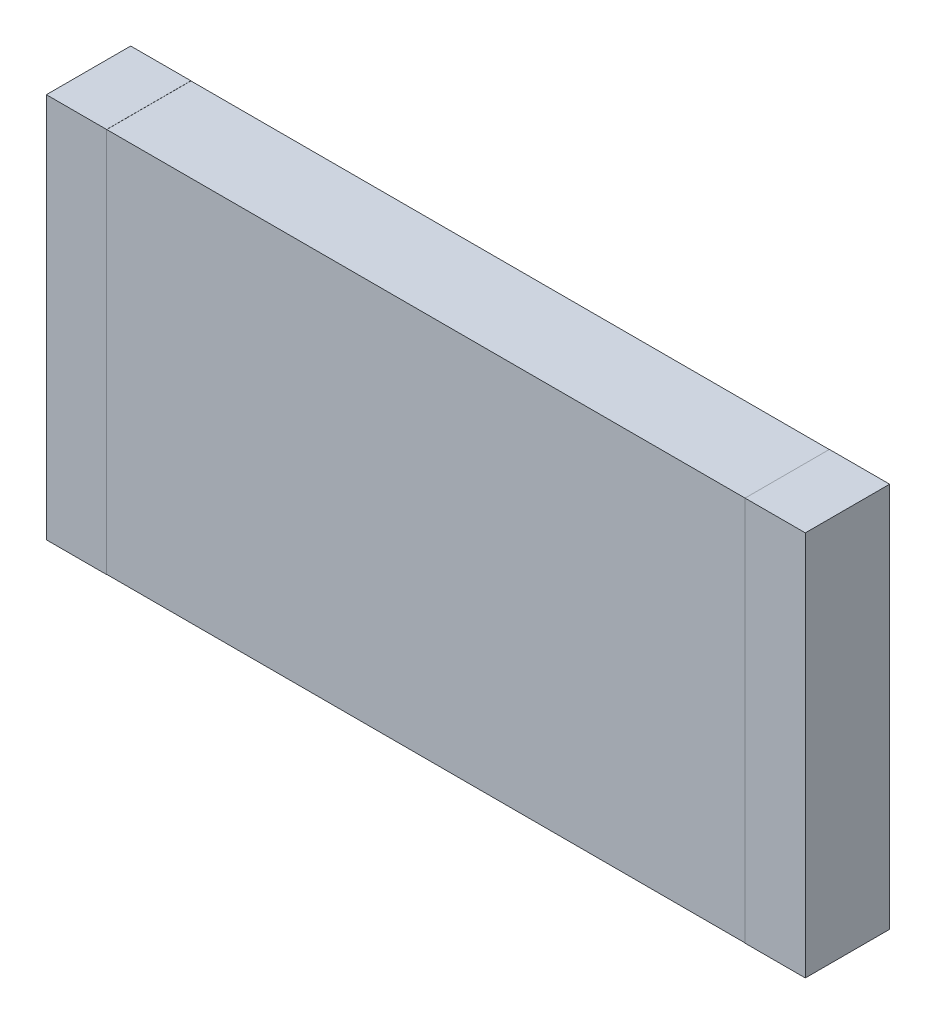
ISO-10303-21;
HEADER;
FILE_DESCRIPTION(('STEP AP214'),'2;1');
FILE_NAME('part.step','',(''),(''),'','','');
FILE_SCHEMA(('AUTOMOTIVE_DESIGN { 1 0 10303 214 1 1 1 1 }'));
ENDSEC;
DATA;
#1=APPLICATION_CONTEXT('core data for automotive mechanical design processes');
#2=APPLICATION_PROTOCOL_DEFINITION('international standard','automotive_design',2000,#1);
#3=PRODUCT_CONTEXT('',#1,'mechanical');
#4=PRODUCT('Part','Part','',(#3));
#5=PRODUCT_RELATED_PRODUCT_CATEGORY('part','',(#4));
#6=PRODUCT_DEFINITION_FORMATION('','',#4);
#7=PRODUCT_DEFINITION_CONTEXT('part definition',#1,'design');
#8=PRODUCT_DEFINITION('design','',#6,#7);
#9=PRODUCT_DEFINITION_SHAPE('','',#8);
#10=(LENGTH_UNIT() NAMED_UNIT(*) SI_UNIT(.MILLI.,.METRE.));
#11=(NAMED_UNIT(*) PLANE_ANGLE_UNIT() SI_UNIT($,.RADIAN.));
#12=(NAMED_UNIT(*) SI_UNIT($,.STERADIAN.) SOLID_ANGLE_UNIT());
#13=UNCERTAINTY_MEASURE_WITH_UNIT(LENGTH_MEASURE(1.E-05),#10,'distance_accuracy_value','');
#14=(GEOMETRIC_REPRESENTATION_CONTEXT(3) GLOBAL_UNCERTAINTY_ASSIGNED_CONTEXT((#13)) GLOBAL_UNIT_ASSIGNED_CONTEXT((#10,
#11,#12)) REPRESENTATION_CONTEXT('',''));
#15=CARTESIAN_POINT('',(0.,0.,0.));
#16=DIRECTION('',(0.,0.,1.));
#17=DIRECTION('',(1.,0.,0.));
#18=AXIS2_PLACEMENT_3D('',#15,#16,#17);
#19=CARTESIAN_POINT('',(-2.65,1.6,0.7));
#20=DIRECTION('',(-1.,0.,0.));
#21=DIRECTION('',(0.,0.,1.));
#22=AXIS2_PLACEMENT_3D('',#19,#20,#21);
#23=PLANE('',#22);
#24=DIRECTION('',(0.,0.,1.));
#25=VECTOR('',#24,1.);
#26=CARTESIAN_POINT('',(-2.65,1.6,0.7));
#27=LINE('',#26,#25);
#28=CARTESIAN_POINT('',(-2.65,1.6,0.7));
#29=VERTEX_POINT('',#28);
#30=CARTESIAN_POINT('',(-2.65,1.6,0.));
#31=VERTEX_POINT('',#30);
#32=EDGE_CURVE('E109',#29,#31,#27,.F.);
#33=ORIENTED_EDGE('',*,*,#32,.F.);
#34=DIRECTION('',(0.,1.,0.));
#35=VECTOR('',#34,1.);
#36=CARTESIAN_POINT('',(-2.65,0.,0.7));
#37=LINE('',#36,#35);
#38=CARTESIAN_POINT('',(-2.65,-1.6,0.7));
#39=VERTEX_POINT('',#38);
#40=EDGE_CURVE('E108',#39,#29,#37,.T.);
#41=ORIENTED_EDGE('',*,*,#40,.F.);
#42=DIRECTION('',(0.,0.,1.));
#43=VECTOR('',#42,1.);
#44=CARTESIAN_POINT('',(-2.65,-1.6,0.7));
#45=LINE('',#44,#43);
#46=CARTESIAN_POINT('',(-2.65,-1.6,0.));
#47=VERTEX_POINT('',#46);
#48=EDGE_CURVE('E106',#47,#39,#45,.T.);
#49=ORIENTED_EDGE('',*,*,#48,.F.);
#50=DIRECTION('',(0.,1.,0.));
#51=VECTOR('',#50,1.);
#52=CARTESIAN_POINT('',(-2.65,0.,0.));
#53=LINE('',#52,#51);
#54=CARTESIAN_POINT('',(-2.65,-1.599,0.));
#55=VERTEX_POINT('',#54);
#56=EDGE_CURVE('E20',#55,#47,#53,.F.);
#57=ORIENTED_EDGE('',*,*,#56,.F.);
#58=DIRECTION('',(0.,0.,1.));
#59=VECTOR('',#58,1.);
#60=CARTESIAN_POINT('',(-2.65,-1.599,0.7));
#61=LINE('',#60,#59);
#62=CARTESIAN_POINT('',(-2.65,-1.599,0.699));
#63=VERTEX_POINT('',#62);
#64=EDGE_CURVE('E120',#63,#55,#61,.F.);
#65=ORIENTED_EDGE('',*,*,#64,.F.);
#66=DIRECTION('',(0.,1.,0.));
#67=VECTOR('',#66,1.);
#68=CARTESIAN_POINT('',(-2.65,-1.6,0.699000000000001));
#69=LINE('',#68,#67);
#70=CARTESIAN_POINT('',(-2.65,1.599,0.699));
#71=VERTEX_POINT('',#70);
#72=EDGE_CURVE('E137',#63,#71,#69,.T.);
#73=ORIENTED_EDGE('',*,*,#72,.T.);
#74=DIRECTION('',(0.,0.,1.));
#75=VECTOR('',#74,1.);
#76=CARTESIAN_POINT('',(-2.65,1.599,0.7));
#77=LINE('',#76,#75);
#78=CARTESIAN_POINT('',(-2.65,1.599,0.));
#79=VERTEX_POINT('',#78);
#80=EDGE_CURVE('E121',#79,#71,#77,.T.);
#81=ORIENTED_EDGE('',*,*,#80,.F.);
#82=DIRECTION('',(0.,1.,0.));
#83=VECTOR('',#82,1.);
#84=CARTESIAN_POINT('',(-2.65,0.,0.));
#85=LINE('',#84,#83);
#86=EDGE_CURVE('E165',#31,#79,#85,.F.);
#87=ORIENTED_EDGE('',*,*,#86,.F.);
#88=EDGE_LOOP('',(#33,#41,#49,#57,#65,#73,#81,#87));
#89=FACE_BOUND('',#88,.T.);
#90=ADVANCED_FACE('F17',(#89),#23,.F.);
#91=CARTESIAN_POINT('',(2.65,1.6,0.7));
#92=DIRECTION('',(1.,0.,0.));
#93=DIRECTION('',(0.,0.,-1.));
#94=AXIS2_PLACEMENT_3D('',#91,#92,#93);
#95=PLANE('',#94);
#96=DIRECTION('',(0.,0.,-1.));
#97=VECTOR('',#96,1.);
#98=CARTESIAN_POINT('',(2.65,1.599,0.7));
#99=LINE('',#98,#97);
#100=CARTESIAN_POINT('',(2.65,1.599,0.699));
#101=VERTEX_POINT('',#100);
#102=CARTESIAN_POINT('',(2.65,1.599,0.));
#103=VERTEX_POINT('',#102);
#104=EDGE_CURVE('E161',#101,#103,#99,.T.);
#105=ORIENTED_EDGE('',*,*,#104,.F.);
#106=DIRECTION('',(0.,1.,0.));
#107=VECTOR('',#106,1.);
#108=CARTESIAN_POINT('',(2.65,-1.6,0.699));
#109=LINE('',#108,#107);
#110=CARTESIAN_POINT('',(2.65,-1.599,0.699));
#111=VERTEX_POINT('',#110);
#112=EDGE_CURVE('E133',#101,#111,#109,.F.);
#113=ORIENTED_EDGE('',*,*,#112,.T.);
#114=DIRECTION('',(0.,0.,-1.));
#115=VECTOR('',#114,1.);
#116=CARTESIAN_POINT('',(2.65,-1.599,0.7));
#117=LINE('',#116,#115);
#118=CARTESIAN_POINT('',(2.65,-1.599,0.));
#119=VERTEX_POINT('',#118);
#120=EDGE_CURVE('E163',#119,#111,#117,.F.);
#121=ORIENTED_EDGE('',*,*,#120,.F.);
#122=DIRECTION('',(0.,1.,0.));
#123=VECTOR('',#122,1.);
#124=CARTESIAN_POINT('',(2.65,0.,0.));
#125=LINE('',#124,#123);
#126=CARTESIAN_POINT('',(2.65,-1.6,0.));
#127=VERTEX_POINT('',#126);
#128=EDGE_CURVE('E162',#127,#119,#125,.T.);
#129=ORIENTED_EDGE('',*,*,#128,.F.);
#130=DIRECTION('',(0.,0.,-1.));
#131=VECTOR('',#130,1.);
#132=CARTESIAN_POINT('',(2.65,-1.6,0.7));
#133=LINE('',#132,#131);
#134=CARTESIAN_POINT('',(2.65,-1.6,0.7));
#135=VERTEX_POINT('',#134);
#136=EDGE_CURVE('E164',#135,#127,#133,.T.);
#137=ORIENTED_EDGE('',*,*,#136,.F.);
#138=DIRECTION('',(0.,1.,0.));
#139=VECTOR('',#138,1.);
#140=CARTESIAN_POINT('',(2.65,0.,0.7));
#141=LINE('',#140,#139);
#142=CARTESIAN_POINT('',(2.65,1.6,0.7));
#143=VERTEX_POINT('',#142);
#144=EDGE_CURVE('E160',#143,#135,#141,.F.);
#145=ORIENTED_EDGE('',*,*,#144,.F.);
#146=DIRECTION('',(0.,0.,-1.));
#147=VECTOR('',#146,1.);
#148=CARTESIAN_POINT('',(2.65,1.6,0.7));
#149=LINE('',#148,#147);
#150=CARTESIAN_POINT('',(2.65,1.6,0.));
#151=VERTEX_POINT('',#150);
#152=EDGE_CURVE('E167',#151,#143,#149,.F.);
#153=ORIENTED_EDGE('',*,*,#152,.F.);
#154=DIRECTION('',(0.,1.,0.));
#155=VECTOR('',#154,1.);
#156=CARTESIAN_POINT('',(2.65,0.,0.));
#157=LINE('',#156,#155);
#158=EDGE_CURVE('E157',#103,#151,#157,.T.);
#159=ORIENTED_EDGE('',*,*,#158,.F.);
#160=EDGE_LOOP('',(#105,#113,#121,#129,#137,#145,#153,#159));
#161=FACE_BOUND('',#160,.T.);
#162=ADVANCED_FACE('F284',(#161),#95,.F.);
#163=CARTESIAN_POINT('',(0.,0.,0.7));
#164=DIRECTION('',(0.,0.,1.));
#165=DIRECTION('',(1.,0.,0.));
#166=AXIS2_PLACEMENT_3D('',#163,#164,#165);
#167=PLANE('',#166);
#168=DIRECTION('',(0.,-1.,0.));
#169=VECTOR('',#168,1.);
#170=CARTESIAN_POINT('',(3.15,1.6,0.7));
#171=LINE('',#170,#169);
#172=CARTESIAN_POINT('',(3.15,-1.6,0.7));
#173=VERTEX_POINT('',#172);
#174=CARTESIAN_POINT('',(3.15,1.6,0.7));
#175=VERTEX_POINT('',#174);
#176=EDGE_CURVE('E208',#173,#175,#171,.F.);
#177=ORIENTED_EDGE('',*,*,#176,.T.);
#178=DIRECTION('',(1.,0.,0.));
#179=VECTOR('',#178,1.);
#180=CARTESIAN_POINT('',(0.,1.6,0.7));
#181=LINE('',#180,#179);
#182=EDGE_CURVE('E196',#175,#143,#181,.F.);
#183=ORIENTED_EDGE('',*,*,#182,.T.);
#184=ORIENTED_EDGE('',*,*,#144,.T.);
#185=DIRECTION('',(1.,0.,0.));
#186=VECTOR('',#185,1.);
#187=CARTESIAN_POINT('',(-3.15,-1.6,0.7));
#188=LINE('',#187,#186);
#189=EDGE_CURVE('E136',#135,#173,#188,.T.);
#190=ORIENTED_EDGE('',*,*,#189,.T.);
#191=EDGE_LOOP('',(#177,#183,#184,#190));
#192=FACE_BOUND('',#191,.T.);
#193=ADVANCED_FACE('F274',(#192),#167,.T.);
#194=CARTESIAN_POINT('',(0.,0.,0.7));
#195=DIRECTION('',(0.,0.,1.));
#196=DIRECTION('',(1.,0.,0.));
#197=AXIS2_PLACEMENT_3D('',#194,#195,#196);
#198=PLANE('',#197);
#199=DIRECTION('',(1.,0.,0.));
#200=VECTOR('',#199,1.);
#201=CARTESIAN_POINT('',(-3.15,1.6,0.7));
#202=LINE('',#201,#200);
#203=CARTESIAN_POINT('',(-3.15,1.6,0.7));
#204=VERTEX_POINT('',#203);
#205=EDGE_CURVE('E143',#29,#204,#202,.F.);
#206=ORIENTED_EDGE('',*,*,#205,.T.);
#207=DIRECTION('',(0.,1.,0.));
#208=VECTOR('',#207,1.);
#209=CARTESIAN_POINT('',(-3.15,1.6,0.7));
#210=LINE('',#209,#208);
#211=CARTESIAN_POINT('',(-3.15,-1.6,0.7));
#212=VERTEX_POINT('',#211);
#213=EDGE_CURVE('E223',#204,#212,#210,.F.);
#214=ORIENTED_EDGE('',*,*,#213,.T.);
#215=DIRECTION('',(1.,0.,0.));
#216=VECTOR('',#215,1.);
#217=CARTESIAN_POINT('',(0.,-1.6,0.7));
#218=LINE('',#217,#216);
#219=EDGE_CURVE('E205',#212,#39,#218,.T.);
#220=ORIENTED_EDGE('',*,*,#219,.T.);
#221=ORIENTED_EDGE('',*,*,#40,.T.);
#222=EDGE_LOOP('',(#206,#214,#220,#221));
#223=FACE_BOUND('',#222,.T.);
#224=ADVANCED_FACE('F271',(#223),#198,.T.);
#225=CARTESIAN_POINT('',(2.65,-1.6,0.699));
#226=DIRECTION('',(0.,0.,-1.));
#227=DIRECTION('',(-1.,0.,0.));
#228=AXIS2_PLACEMENT_3D('',#225,#226,#227);
#229=PLANE('',#228);
#230=DIRECTION('',(1.,0.,0.));
#231=VECTOR('',#230,1.);
#232=CARTESIAN_POINT('',(2.65,1.599,0.699));
#233=LINE('',#232,#231);
#234=EDGE_CURVE('E140',#101,#71,#233,.F.);
#235=ORIENTED_EDGE('',*,*,#234,.T.);
#236=ORIENTED_EDGE('',*,*,#72,.F.);
#237=DIRECTION('',(1.,0.,0.));
#238=VECTOR('',#237,1.);
#239=CARTESIAN_POINT('',(2.65,-1.599,0.699));
#240=LINE('',#239,#238);
#241=EDGE_CURVE('E147',#63,#111,#240,.T.);
#242=ORIENTED_EDGE('',*,*,#241,.T.);
#243=ORIENTED_EDGE('',*,*,#112,.F.);
#244=EDGE_LOOP('',(#235,#236,#242,#243));
#245=FACE_BOUND('',#244,.T.);
#246=ADVANCED_FACE('F273',(#245),#229,.F.);
#247=CARTESIAN_POINT('',(-3.15,-1.6,0.7));
#248=DIRECTION('',(0.,1.,0.));
#249=DIRECTION('',(0.,0.,1.));
#250=AXIS2_PLACEMENT_3D('',#247,#248,#249);
#251=PLANE('',#250);
#252=ORIENTED_EDGE('',*,*,#136,.T.);
#253=DIRECTION('',(1.,0.,0.));
#254=VECTOR('',#253,1.);
#255=CARTESIAN_POINT('',(0.,-1.6,0.));
#256=LINE('',#255,#254);
#257=CARTESIAN_POINT('',(3.15,-1.6,0.));
#258=VERTEX_POINT('',#257);
#259=EDGE_CURVE('E150',#127,#258,#256,.T.);
#260=ORIENTED_EDGE('',*,*,#259,.T.);
#261=DIRECTION('',(0.,0.,1.));
#262=VECTOR('',#261,1.);
#263=CARTESIAN_POINT('',(3.15,-1.6,0.7));
#264=LINE('',#263,#262);
#265=EDGE_CURVE('E200',#258,#173,#264,.T.);
#266=ORIENTED_EDGE('',*,*,#265,.T.);
#267=ORIENTED_EDGE('',*,*,#189,.F.);
#268=EDGE_LOOP('',(#252,#260,#266,#267));
#269=FACE_BOUND('',#268,.T.);
#270=ADVANCED_FACE('F281',(#269),#251,.F.);
#271=CARTESIAN_POINT('',(3.15,1.6,0.7));
#272=DIRECTION('',(-1.,0.,0.));
#273=DIRECTION('',(0.,-1.,0.));
#274=AXIS2_PLACEMENT_3D('',#271,#272,#273);
#275=PLANE('',#274);
#276=DIRECTION('',(0.,0.,-1.));
#277=VECTOR('',#276,1.);
#278=CARTESIAN_POINT('',(3.15,1.6,0.7));
#279=LINE('',#278,#277);
#280=CARTESIAN_POINT('',(3.15,1.6,0.));
#281=VERTEX_POINT('',#280);
#282=EDGE_CURVE('E144',#281,#175,#279,.F.);
#283=ORIENTED_EDGE('',*,*,#282,.T.);
#284=ORIENTED_EDGE('',*,*,#176,.F.);
#285=ORIENTED_EDGE('',*,*,#265,.F.);
#286=DIRECTION('',(0.,1.,0.));
#287=VECTOR('',#286,1.);
#288=CARTESIAN_POINT('',(3.15,0.,0.));
#289=LINE('',#288,#287);
#290=EDGE_CURVE('E232',#258,#281,#289,.T.);
#291=ORIENTED_EDGE('',*,*,#290,.T.);
#292=EDGE_LOOP('',(#283,#284,#285,#291));
#293=FACE_BOUND('',#292,.T.);
#294=ADVANCED_FACE('F308',(#293),#275,.F.);
#295=CARTESIAN_POINT('',(-3.15,1.6,0.7));
#296=DIRECTION('',(0.,-1.,0.));
#297=DIRECTION('',(0.,0.,-1.));
#298=AXIS2_PLACEMENT_3D('',#295,#296,#297);
#299=PLANE('',#298);
#300=ORIENTED_EDGE('',*,*,#152,.T.);
#301=ORIENTED_EDGE('',*,*,#182,.F.);
#302=ORIENTED_EDGE('',*,*,#282,.F.);
#303=DIRECTION('',(1.,0.,0.));
#304=VECTOR('',#303,1.);
#305=CARTESIAN_POINT('',(0.,1.6,0.));
#306=LINE('',#305,#304);
#307=EDGE_CURVE('E235',#281,#151,#306,.F.);
#308=ORIENTED_EDGE('',*,*,#307,.T.);
#309=EDGE_LOOP('',(#300,#301,#302,#308));
#310=FACE_BOUND('',#309,.T.);
#311=ADVANCED_FACE('F304',(#310),#299,.F.);
#312=CARTESIAN_POINT('',(2.65,1.599,0.7));
#313=DIRECTION('',(0.,-1.,0.));
#314=DIRECTION('',(0.,0.,-1.));
#315=AXIS2_PLACEMENT_3D('',#312,#313,#314);
#316=PLANE('',#315);
#317=ORIENTED_EDGE('',*,*,#234,.F.);
#318=ORIENTED_EDGE('',*,*,#104,.T.);
#319=DIRECTION('',(1.,0.,0.));
#320=VECTOR('',#319,1.);
#321=CARTESIAN_POINT('',(0.,1.599,0.));
#322=LINE('',#321,#320);
#323=EDGE_CURVE('E259',#103,#79,#322,.F.);
#324=ORIENTED_EDGE('',*,*,#323,.T.);
#325=ORIENTED_EDGE('',*,*,#80,.T.);
#326=EDGE_LOOP('',(#317,#318,#324,#325));
#327=FACE_BOUND('',#326,.T.);
#328=ADVANCED_FACE('F301',(#327),#316,.F.);
#329=CARTESIAN_POINT('',(-3.15,1.6,0.7));
#330=DIRECTION('',(0.,-1.,0.));
#331=DIRECTION('',(0.,0.,-1.));
#332=AXIS2_PLACEMENT_3D('',#329,#330,#331);
#333=PLANE('',#332);
#334=ORIENTED_EDGE('',*,*,#32,.T.);
#335=DIRECTION('',(1.,0.,0.));
#336=VECTOR('',#335,1.);
#337=CARTESIAN_POINT('',(0.,1.6,0.));
#338=LINE('',#337,#336);
#339=CARTESIAN_POINT('',(-3.15,1.6,0.));
#340=VERTEX_POINT('',#339);
#341=EDGE_CURVE('E247',#31,#340,#338,.F.);
#342=ORIENTED_EDGE('',*,*,#341,.T.);
#343=DIRECTION('',(0.,0.,1.));
#344=VECTOR('',#343,1.);
#345=CARTESIAN_POINT('',(-3.15,1.6,0.7));
#346=LINE('',#345,#344);
#347=EDGE_CURVE('E217',#340,#204,#346,.T.);
#348=ORIENTED_EDGE('',*,*,#347,.T.);
#349=ORIENTED_EDGE('',*,*,#205,.F.);
#350=EDGE_LOOP('',(#334,#342,#348,#349));
#351=FACE_BOUND('',#350,.T.);
#352=ADVANCED_FACE('F266',(#351),#333,.F.);
#353=CARTESIAN_POINT('',(-3.15,1.6,0.7));
#354=DIRECTION('',(1.,0.,0.));
#355=DIRECTION('',(0.,1.,0.));
#356=AXIS2_PLACEMENT_3D('',#353,#354,#355);
#357=PLANE('',#356);
#358=DIRECTION('',(0.,0.,1.));
#359=VECTOR('',#358,1.);
#360=CARTESIAN_POINT('',(-3.15,-1.6,0.7));
#361=LINE('',#360,#359);
#362=CARTESIAN_POINT('',(-3.15,-1.6,0.));
#363=VERTEX_POINT('',#362);
#364=EDGE_CURVE('E35',#363,#212,#361,.T.);
#365=ORIENTED_EDGE('',*,*,#364,.T.);
#366=ORIENTED_EDGE('',*,*,#213,.F.);
#367=ORIENTED_EDGE('',*,*,#347,.F.);
#368=DIRECTION('',(0.,1.,0.));
#369=VECTOR('',#368,1.);
#370=CARTESIAN_POINT('',(-3.15,0.,0.));
#371=LINE('',#370,#369);
#372=EDGE_CURVE('E115',#340,#363,#371,.F.);
#373=ORIENTED_EDGE('',*,*,#372,.T.);
#374=EDGE_LOOP('',(#365,#366,#367,#373));
#375=FACE_BOUND('',#374,.T.);
#376=ADVANCED_FACE('F268',(#375),#357,.F.);
#377=CARTESIAN_POINT('',(-3.15,-1.6,0.7));
#378=DIRECTION('',(0.,1.,0.));
#379=DIRECTION('',(0.,0.,1.));
#380=AXIS2_PLACEMENT_3D('',#377,#378,#379);
#381=PLANE('',#380);
#382=ORIENTED_EDGE('',*,*,#48,.T.);
#383=ORIENTED_EDGE('',*,*,#219,.F.);
#384=ORIENTED_EDGE('',*,*,#364,.F.);
#385=DIRECTION('',(1.,0.,0.));
#386=VECTOR('',#385,1.);
#387=CARTESIAN_POINT('',(0.,-1.6,0.));
#388=LINE('',#387,#386);
#389=EDGE_CURVE('E26',#363,#47,#388,.T.);
#390=ORIENTED_EDGE('',*,*,#389,.T.);
#391=EDGE_LOOP('',(#382,#383,#384,#390));
#392=FACE_BOUND('',#391,.T.);
#393=ADVANCED_FACE('F111',(#392),#381,.F.);
#394=CARTESIAN_POINT('',(2.65,-1.599,0.7));
#395=DIRECTION('',(0.,1.,0.));
#396=DIRECTION('',(0.,0.,1.));
#397=AXIS2_PLACEMENT_3D('',#394,#395,#396);
#398=PLANE('',#397);
#399=ORIENTED_EDGE('',*,*,#241,.F.);
#400=ORIENTED_EDGE('',*,*,#64,.T.);
#401=DIRECTION('',(1.,0.,0.));
#402=VECTOR('',#401,1.);
#403=CARTESIAN_POINT('',(0.,-1.599,0.));
#404=LINE('',#403,#402);
#405=EDGE_CURVE('E11',#55,#119,#404,.T.);
#406=ORIENTED_EDGE('',*,*,#405,.T.);
#407=ORIENTED_EDGE('',*,*,#120,.T.);
#408=EDGE_LOOP('',(#399,#400,#406,#407));
#409=FACE_BOUND('',#408,.T.);
#410=ADVANCED_FACE('F288',(#409),#398,.F.);
#411=CARTESIAN_POINT('',(0.,0.,0.));
#412=DIRECTION('',(0.,0.,1.));
#413=DIRECTION('',(1.,0.,0.));
#414=AXIS2_PLACEMENT_3D('',#411,#412,#413);
#415=PLANE('',#414);
#416=ORIENTED_EDGE('',*,*,#56,.T.);
#417=ORIENTED_EDGE('',*,*,#389,.F.);
#418=ORIENTED_EDGE('',*,*,#372,.F.);
#419=ORIENTED_EDGE('',*,*,#341,.F.);
#420=ORIENTED_EDGE('',*,*,#86,.T.);
#421=ORIENTED_EDGE('',*,*,#323,.F.);
#422=ORIENTED_EDGE('',*,*,#158,.T.);
#423=ORIENTED_EDGE('',*,*,#307,.F.);
#424=ORIENTED_EDGE('',*,*,#290,.F.);
#425=ORIENTED_EDGE('',*,*,#259,.F.);
#426=ORIENTED_EDGE('',*,*,#128,.T.);
#427=ORIENTED_EDGE('',*,*,#405,.F.);
#428=EDGE_LOOP('',(#416,#417,#418,#419,#420,#421,#422,#423,#424,#425,#426,#427));
#429=FACE_BOUND('',#428,.T.);
#430=ADVANCED_FACE('F117',(#429),#415,.F.);
#431=CLOSED_SHELL('',(#90,#162,#193,#224,#246,#270,#294,#311,#328,#352,#376,#393,#410,#430));
#432=MANIFOLD_SOLID_BREP('B1',#431);
#433=ADVANCED_BREP_SHAPE_REPRESENTATION('',(#18,#432),#14);
#434=SHAPE_DEFINITION_REPRESENTATION(#9,#433);
ENDSEC;
END-ISO-10303-21;
